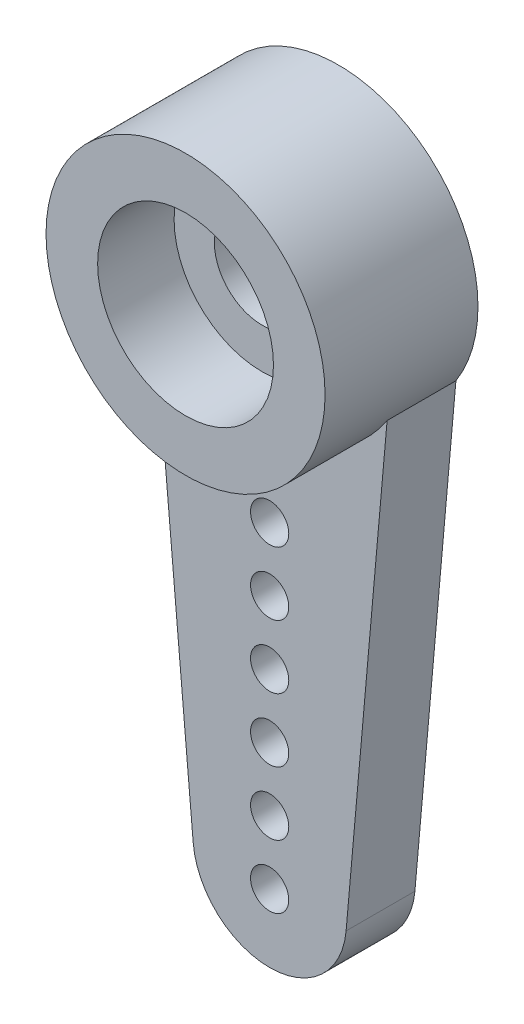
ISO-10303-21;
HEADER;
FILE_DESCRIPTION(('STEP AP214'),'2;1');
FILE_NAME('part.step','',(''),(''),'','','');
FILE_SCHEMA(('AUTOMOTIVE_DESIGN { 1 0 10303 214 1 1 1 1 }'));
ENDSEC;
DATA;
#1=APPLICATION_CONTEXT('core data for automotive mechanical design processes');
#2=APPLICATION_PROTOCOL_DEFINITION('international standard','automotive_design',2000,#1);
#3=PRODUCT_CONTEXT('',#1,'mechanical');
#4=PRODUCT('Part','Part','',(#3));
#5=PRODUCT_RELATED_PRODUCT_CATEGORY('part','',(#4));
#6=PRODUCT_DEFINITION_FORMATION('','',#4);
#7=PRODUCT_DEFINITION_CONTEXT('part definition',#1,'design');
#8=PRODUCT_DEFINITION('design','',#6,#7);
#9=PRODUCT_DEFINITION_SHAPE('','',#8);
#10=(LENGTH_UNIT() NAMED_UNIT(*) SI_UNIT(.MILLI.,.METRE.));
#11=(NAMED_UNIT(*) PLANE_ANGLE_UNIT() SI_UNIT($,.RADIAN.));
#12=(NAMED_UNIT(*) SI_UNIT($,.STERADIAN.) SOLID_ANGLE_UNIT());
#13=UNCERTAINTY_MEASURE_WITH_UNIT(LENGTH_MEASURE(1.E-05),#10,'distance_accuracy_value','');
#14=(GEOMETRIC_REPRESENTATION_CONTEXT(3) GLOBAL_UNCERTAINTY_ASSIGNED_CONTEXT((#13)) GLOBAL_UNIT_ASSIGNED_CONTEXT((#10,
#11,#12)) REPRESENTATION_CONTEXT('',''));
#15=CARTESIAN_POINT('',(0.,0.,0.));
#16=DIRECTION('',(0.,0.,1.));
#17=DIRECTION('',(1.,0.,0.));
#18=AXIS2_PLACEMENT_3D('',#15,#16,#17);
#19=CARTESIAN_POINT('',(0.,22.2676086956522,4.));
#20=DIRECTION('',(0.,0.,-1.));
#21=DIRECTION('',(-1.,0.,0.));
#22=AXIS2_PLACEMENT_3D('',#19,#20,#21);
#23=CYLINDRICAL_SURFACE('',#22,1.245);
#24=CARTESIAN_POINT('',(0.,22.2676086956522,0.));
#25=DIRECTION('',(0.,0.,-1.));
#26=DIRECTION('',(-1.,0.,0.));
#27=AXIS2_PLACEMENT_3D('',#24,#25,#26);
#28=CIRCLE('',#27,1.245);
#29=CARTESIAN_POINT('',(-1.245,22.2676086956522,0.));
#30=VERTEX_POINT('',#29);
#31=EDGE_CURVE('E85',#30,#30,#28,.T.);
#32=ORIENTED_EDGE('',*,*,#31,.T.);
#33=EDGE_LOOP('',(#32));
#34=FACE_BOUND('',#33,.T.);
#35=CARTESIAN_POINT('',(0.,22.2676086956522,2.));
#36=DIRECTION('',(0.,0.,1.));
#37=DIRECTION('',(1.,0.,0.));
#38=AXIS2_PLACEMENT_3D('',#35,#36,#37);
#39=CIRCLE('',#38,1.245);
#40=CARTESIAN_POINT('',(1.245,22.2676086956522,2.));
#41=VERTEX_POINT('',#40);
#42=EDGE_CURVE('E121',#41,#41,#39,.T.);
#43=ORIENTED_EDGE('',*,*,#42,.T.);
#44=EDGE_LOOP('',(#43));
#45=FACE_BOUND('',#44,.T.);
#46=ADVANCED_FACE('F37',(#34,#45),#23,.F.);
#47=CARTESIAN_POINT('',(-1.26331645783322,-0.111998607049884,1.8));
#48=DIRECTION('',(0.996093209916575,0.0883080809331399,0.));
#49=DIRECTION('',(-0.0883080809331399,0.996093209916575,0.));
#50=AXIS2_PLACEMENT_3D('',#47,#48,#49);
#51=PLANE('',#50);
#52=DIRECTION('',(0.0883080809331399,-0.996093209916575,0.));
#53=VECTOR('',#52,1.);
#54=CARTESIAN_POINT('',(-1.26331645783322,-0.111998607049884,0.));
#55=LINE('',#54,#53);
#56=CARTESIAN_POINT('',(-3.07271866593739,20.2976086956522,0.));
#57=VERTEX_POINT('',#56);
#58=CARTESIAN_POINT('',(-2.,8.19760869565218,0.));
#59=VERTEX_POINT('',#58);
#60=EDGE_CURVE('E80',#57,#59,#55,.T.);
#61=ORIENTED_EDGE('',*,*,#60,.T.);
#62=DIRECTION('',(0.,0.,-1.));
#63=VECTOR('',#62,1.);
#64=CARTESIAN_POINT('',(-2.,8.19760869565218,1.8));
#65=LINE('',#64,#63);
#66=CARTESIAN_POINT('',(-2.,8.19760869565218,1.8));
#67=VERTEX_POINT('',#66);
#68=EDGE_CURVE('E11',#67,#59,#65,.T.);
#69=ORIENTED_EDGE('',*,*,#68,.F.);
#70=DIRECTION('',(0.0883080809331399,-0.996093209916575,0.));
#71=VECTOR('',#70,1.);
#72=CARTESIAN_POINT('',(-1.26331645783322,-0.111998607049884,1.8));
#73=LINE('',#72,#71);
#74=CARTESIAN_POINT('',(-3.07271866593738,20.2976086956522,1.8));
#75=VERTEX_POINT('',#74);
#76=EDGE_CURVE('E96',#75,#67,#73,.T.);
#77=ORIENTED_EDGE('',*,*,#76,.F.);
#78=DIRECTION('',(0.,0.,-1.));
#79=VECTOR('',#78,1.);
#80=CARTESIAN_POINT('',(-3.07271866593739,20.2976086956522,1.8));
#81=LINE('',#80,#79);
#82=EDGE_CURVE('E93',#75,#57,#81,.T.);
#83=ORIENTED_EDGE('',*,*,#82,.T.);
#84=EDGE_LOOP('',(#61,#69,#77,#83));
#85=FACE_BOUND('',#84,.T.);
#86=ADVANCED_FACE('F39',(#85),#51,.F.);
#87=CARTESIAN_POINT('',(0.,8.37491756605505,1.8));
#88=DIRECTION('',(0.,0.,-1.));
#89=DIRECTION('',(-1.,0.,0.));
#90=AXIS2_PLACEMENT_3D('',#87,#88,#89);
#91=CYLINDRICAL_SURFACE('',#90,2.00784422591085);
#92=CARTESIAN_POINT('',(0.,8.37491756605505,0.));
#93=DIRECTION('',(0.,0.,1.));
#94=DIRECTION('',(1.,0.,0.));
#95=AXIS2_PLACEMENT_3D('',#92,#93,#94);
#96=CIRCLE('',#95,2.00784422591085);
#97=CARTESIAN_POINT('',(2.,8.19760869565218,0.));
#98=VERTEX_POINT('',#97);
#99=EDGE_CURVE('E97',#59,#98,#96,.T.);
#100=ORIENTED_EDGE('',*,*,#99,.T.);
#101=DIRECTION('',(0.,0.,-1.));
#102=VECTOR('',#101,1.);
#103=CARTESIAN_POINT('',(2.,8.19760869565218,1.8));
#104=LINE('',#103,#102);
#105=CARTESIAN_POINT('',(2.,8.19760869565218,1.8));
#106=VERTEX_POINT('',#105);
#107=EDGE_CURVE('E46',#106,#98,#104,.T.);
#108=ORIENTED_EDGE('',*,*,#107,.F.);
#109=CARTESIAN_POINT('',(0.,8.37491756605505,1.8));
#110=DIRECTION('',(0.,0.,1.));
#111=DIRECTION('',(1.,0.,0.));
#112=AXIS2_PLACEMENT_3D('',#109,#110,#111);
#113=CIRCLE('',#112,2.00784422591085);
#114=EDGE_CURVE('E54',#67,#106,#113,.T.);
#115=ORIENTED_EDGE('',*,*,#114,.F.);
#116=ORIENTED_EDGE('',*,*,#68,.T.);
#117=EDGE_LOOP('',(#100,#108,#115,#116));
#118=FACE_BOUND('',#117,.T.);
#119=ADVANCED_FACE('F180',(#118),#91,.T.);
#120=CARTESIAN_POINT('',(1.26331645783321,-0.111998607049883,1.8));
#121=DIRECTION('',(0.996093209916575,-0.0883080809331397,0.));
#122=DIRECTION('',(0.0883080809331397,0.996093209916575,0.));
#123=AXIS2_PLACEMENT_3D('',#120,#121,#122);
#124=PLANE('',#123);
#125=DIRECTION('',(-0.0883080809331397,-0.996093209916575,0.));
#126=VECTOR('',#125,1.);
#127=CARTESIAN_POINT('',(1.26331645783321,-0.111998607049883,0.));
#128=LINE('',#127,#126);
#129=CARTESIAN_POINT('',(3.07271866593738,20.2976086956522,0.));
#130=VERTEX_POINT('',#129);
#131=EDGE_CURVE('E77',#130,#98,#128,.T.);
#132=ORIENTED_EDGE('',*,*,#131,.F.);
#133=DIRECTION('',(0.,0.,-1.));
#134=VECTOR('',#133,1.);
#135=CARTESIAN_POINT('',(3.07271866593738,20.2976086956522,1.8));
#136=LINE('',#135,#134);
#137=CARTESIAN_POINT('',(3.07271866593737,20.2976086956522,1.8));
#138=VERTEX_POINT('',#137);
#139=EDGE_CURVE('E89',#138,#130,#136,.T.);
#140=ORIENTED_EDGE('',*,*,#139,.F.);
#141=DIRECTION('',(-0.0883080809331397,-0.996093209916575,0.));
#142=VECTOR('',#141,1.);
#143=CARTESIAN_POINT('',(1.26331645783321,-0.111998607049883,1.8));
#144=LINE('',#143,#142);
#145=EDGE_CURVE('E105',#138,#106,#144,.T.);
#146=ORIENTED_EDGE('',*,*,#145,.T.);
#147=ORIENTED_EDGE('',*,*,#107,.T.);
#148=EDGE_LOOP('',(#132,#140,#146,#147));
#149=FACE_BOUND('',#148,.T.);
#150=ADVANCED_FACE('F95',(#149),#124,.T.);
#151=CARTESIAN_POINT('',(0.,0.,1.8));
#152=DIRECTION('',(0.,0.,1.));
#153=DIRECTION('',(1.,0.,0.));
#154=AXIS2_PLACEMENT_3D('',#151,#152,#153);
#155=PLANE('',#154);
#156=CARTESIAN_POINT('',(0.,8.1470733401442,1.8));
#157=DIRECTION('',(0.,0.,1.));
#158=DIRECTION('',(1.,0.,0.));
#159=AXIS2_PLACEMENT_3D('',#156,#157,#158);
#160=CIRCLE('',#159,0.500000015999988);
#161=CARTESIAN_POINT('',(0.500000015999988,8.1470733401442,1.8));
#162=VERTEX_POINT('',#161);
#163=EDGE_CURVE('E159',#162,#162,#160,.T.);
#164=ORIENTED_EDGE('',*,*,#163,.F.);
#165=EDGE_LOOP('',(#164));
#166=FACE_BOUND('',#165,.T.);
#167=CARTESIAN_POINT('',(0.,9.80734101789819,1.8));
#168=DIRECTION('',(0.,0.,1.));
#169=DIRECTION('',(1.,0.,0.));
#170=AXIS2_PLACEMENT_3D('',#167,#168,#169);
#171=CIRCLE('',#170,0.500000015999988);
#172=CARTESIAN_POINT('',(0.500000015999982,9.80734101789819,1.8));
#173=VERTEX_POINT('',#172);
#174=EDGE_CURVE('E153',#173,#173,#171,.T.);
#175=ORIENTED_EDGE('',*,*,#174,.F.);
#176=EDGE_LOOP('',(#175));
#177=FACE_BOUND('',#176,.T.);
#178=CARTESIAN_POINT('',(0.,11.4676086956522,1.8));
#179=DIRECTION('',(0.,0.,1.));
#180=DIRECTION('',(1.,0.,0.));
#181=AXIS2_PLACEMENT_3D('',#178,#179,#180);
#182=CIRCLE('',#181,0.500000015999988);
#183=CARTESIAN_POINT('',(0.500000015999977,11.4676086956522,1.8));
#184=VERTEX_POINT('',#183);
#185=EDGE_CURVE('E147',#184,#184,#182,.T.);
#186=ORIENTED_EDGE('',*,*,#185,.F.);
#187=EDGE_LOOP('',(#186));
#188=FACE_BOUND('',#187,.T.);
#189=CARTESIAN_POINT('',(0.,13.1278763734062,1.8));
#190=DIRECTION('',(0.,0.,1.));
#191=DIRECTION('',(1.,0.,0.));
#192=AXIS2_PLACEMENT_3D('',#189,#190,#191);
#193=CIRCLE('',#192,0.500000015999988);
#194=CARTESIAN_POINT('',(0.500000015999971,13.1278763734062,1.8));
#195=VERTEX_POINT('',#194);
#196=EDGE_CURVE('E141',#195,#195,#193,.T.);
#197=ORIENTED_EDGE('',*,*,#196,.F.);
#198=EDGE_LOOP('',(#197));
#199=FACE_BOUND('',#198,.T.);
#200=CARTESIAN_POINT('',(0.,14.7881440511602,1.8));
#201=DIRECTION('',(0.,0.,1.));
#202=DIRECTION('',(1.,0.,0.));
#203=AXIS2_PLACEMENT_3D('',#200,#201,#202);
#204=CIRCLE('',#203,0.500000015999988);
#205=CARTESIAN_POINT('',(0.500000015999965,14.7881440511602,1.8));
#206=VERTEX_POINT('',#205);
#207=EDGE_CURVE('E135',#206,#206,#204,.T.);
#208=ORIENTED_EDGE('',*,*,#207,.F.);
#209=EDGE_LOOP('',(#208));
#210=FACE_BOUND('',#209,.T.);
#211=CARTESIAN_POINT('',(0.,16.4484117289141,1.8));
#212=DIRECTION('',(0.,0.,1.));
#213=DIRECTION('',(1.,0.,0.));
#214=AXIS2_PLACEMENT_3D('',#211,#212,#213);
#215=CIRCLE('',#214,0.500000015999988);
#216=CARTESIAN_POINT('',(0.500000015999959,16.4484117289141,1.8));
#217=VERTEX_POINT('',#216);
#218=EDGE_CURVE('E129',#217,#217,#215,.T.);
#219=ORIENTED_EDGE('',*,*,#218,.F.);
#220=EDGE_LOOP('',(#219));
#221=FACE_BOUND('',#220,.T.);
#222=ORIENTED_EDGE('',*,*,#76,.T.);
#223=ORIENTED_EDGE('',*,*,#114,.T.);
#224=ORIENTED_EDGE('',*,*,#145,.F.);
#225=CARTESIAN_POINT('',(0.,22.2676086956522,1.8));
#226=DIRECTION('',(0.,0.,1.));
#227=DIRECTION('',(1.,0.,0.));
#228=AXIS2_PLACEMENT_3D('',#225,#226,#227);
#229=CIRCLE('',#228,3.65);
#230=EDGE_CURVE('E92',#75,#138,#229,.T.);
#231=ORIENTED_EDGE('',*,*,#230,.F.);
#232=EDGE_LOOP('',(#222,#223,#224,#231));
#233=FACE_BOUND('',#232,.T.);
#234=ADVANCED_FACE('F165',(#166,#177,#188,#199,#210,#221,#233),#155,.T.);
#235=CARTESIAN_POINT('',(0.,0.,0.));
#236=DIRECTION('',(0.,0.,1.));
#237=DIRECTION('',(1.,0.,0.));
#238=AXIS2_PLACEMENT_3D('',#235,#236,#237);
#239=PLANE('',#238);
#240=CARTESIAN_POINT('',(0.,8.1470733401442,0.));
#241=DIRECTION('',(0.,0.,1.));
#242=DIRECTION('',(1.,0.,0.));
#243=AXIS2_PLACEMENT_3D('',#240,#241,#242);
#244=CIRCLE('',#243,0.500000015999988);
#245=CARTESIAN_POINT('',(0.500000015999988,8.1470733401442,0.));
#246=VERTEX_POINT('',#245);
#247=EDGE_CURVE('E156',#246,#246,#244,.T.);
#248=ORIENTED_EDGE('',*,*,#247,.T.);
#249=EDGE_LOOP('',(#248));
#250=FACE_BOUND('',#249,.T.);
#251=CARTESIAN_POINT('',(0.,9.80734101789819,0.));
#252=DIRECTION('',(0.,0.,1.));
#253=DIRECTION('',(1.,0.,0.));
#254=AXIS2_PLACEMENT_3D('',#251,#252,#253);
#255=CIRCLE('',#254,0.500000015999988);
#256=CARTESIAN_POINT('',(0.500000015999982,9.80734101789819,0.));
#257=VERTEX_POINT('',#256);
#258=EDGE_CURVE('E150',#257,#257,#255,.T.);
#259=ORIENTED_EDGE('',*,*,#258,.T.);
#260=EDGE_LOOP('',(#259));
#261=FACE_BOUND('',#260,.T.);
#262=CARTESIAN_POINT('',(0.,11.4676086956522,0.));
#263=DIRECTION('',(0.,0.,1.));
#264=DIRECTION('',(1.,0.,0.));
#265=AXIS2_PLACEMENT_3D('',#262,#263,#264);
#266=CIRCLE('',#265,0.500000015999988);
#267=CARTESIAN_POINT('',(0.500000015999977,11.4676086956522,0.));
#268=VERTEX_POINT('',#267);
#269=EDGE_CURVE('E144',#268,#268,#266,.T.);
#270=ORIENTED_EDGE('',*,*,#269,.T.);
#271=EDGE_LOOP('',(#270));
#272=FACE_BOUND('',#271,.T.);
#273=CARTESIAN_POINT('',(0.,13.1278763734062,0.));
#274=DIRECTION('',(0.,0.,1.));
#275=DIRECTION('',(1.,0.,0.));
#276=AXIS2_PLACEMENT_3D('',#273,#274,#275);
#277=CIRCLE('',#276,0.500000015999988);
#278=CARTESIAN_POINT('',(0.500000015999971,13.1278763734062,0.));
#279=VERTEX_POINT('',#278);
#280=EDGE_CURVE('E138',#279,#279,#277,.T.);
#281=ORIENTED_EDGE('',*,*,#280,.T.);
#282=EDGE_LOOP('',(#281));
#283=FACE_BOUND('',#282,.T.);
#284=CARTESIAN_POINT('',(0.,14.7881440511602,0.));
#285=DIRECTION('',(0.,0.,1.));
#286=DIRECTION('',(1.,0.,0.));
#287=AXIS2_PLACEMENT_3D('',#284,#285,#286);
#288=CIRCLE('',#287,0.500000015999988);
#289=CARTESIAN_POINT('',(0.500000015999965,14.7881440511602,0.));
#290=VERTEX_POINT('',#289);
#291=EDGE_CURVE('E132',#290,#290,#288,.T.);
#292=ORIENTED_EDGE('',*,*,#291,.T.);
#293=EDGE_LOOP('',(#292));
#294=FACE_BOUND('',#293,.T.);
#295=CARTESIAN_POINT('',(0.,16.4484117289141,0.));
#296=DIRECTION('',(0.,0.,1.));
#297=DIRECTION('',(1.,0.,0.));
#298=AXIS2_PLACEMENT_3D('',#295,#296,#297);
#299=CIRCLE('',#298,0.500000015999988);
#300=CARTESIAN_POINT('',(0.500000015999959,16.4484117289141,0.));
#301=VERTEX_POINT('',#300);
#302=EDGE_CURVE('E126',#301,#301,#299,.T.);
#303=ORIENTED_EDGE('',*,*,#302,.T.);
#304=EDGE_LOOP('',(#303));
#305=FACE_BOUND('',#304,.T.);
#306=ORIENTED_EDGE('',*,*,#60,.F.);
#307=CARTESIAN_POINT('',(0.,22.2676086956522,0.));
#308=DIRECTION('',(0.,0.,-1.));
#309=DIRECTION('',(-1.,0.,0.));
#310=AXIS2_PLACEMENT_3D('',#307,#308,#309);
#311=CIRCLE('',#310,3.65);
#312=EDGE_CURVE('E73',#57,#130,#311,.T.);
#313=ORIENTED_EDGE('',*,*,#312,.T.);
#314=ORIENTED_EDGE('',*,*,#131,.T.);
#315=ORIENTED_EDGE('',*,*,#99,.F.);
#316=EDGE_LOOP('',(#306,#313,#314,#315));
#317=FACE_BOUND('',#316,.T.);
#318=ORIENTED_EDGE('',*,*,#31,.F.);
#319=EDGE_LOOP('',(#318));
#320=FACE_BOUND('',#319,.T.);
#321=ADVANCED_FACE('F75',(#250,#261,#272,#283,#294,#305,#317,#320),#239,.F.);
#322=CARTESIAN_POINT('',(0.,22.2676086956522,4.));
#323=DIRECTION('',(0.,0.,-1.));
#324=DIRECTION('',(-1.,0.,0.));
#325=AXIS2_PLACEMENT_3D('',#322,#323,#324);
#326=CYLINDRICAL_SURFACE('',#325,3.65);
#327=CARTESIAN_POINT('',(0.,22.2676086956522,4.));
#328=DIRECTION('',(0.,0.,-1.));
#329=DIRECTION('',(-1.,0.,0.));
#330=AXIS2_PLACEMENT_3D('',#327,#328,#329);
#331=CIRCLE('',#330,3.65);
#332=CARTESIAN_POINT('',(-3.65,22.2676086956522,4.));
#333=VERTEX_POINT('',#332);
#334=EDGE_CURVE('E84',#333,#333,#331,.T.);
#335=ORIENTED_EDGE('',*,*,#334,.T.);
#336=EDGE_LOOP('',(#335));
#337=FACE_BOUND('',#336,.T.);
#338=ORIENTED_EDGE('',*,*,#82,.F.);
#339=ORIENTED_EDGE('',*,*,#230,.T.);
#340=ORIENTED_EDGE('',*,*,#139,.T.);
#341=ORIENTED_EDGE('',*,*,#312,.F.);
#342=EDGE_LOOP('',(#338,#339,#340,#341));
#343=FACE_BOUND('',#342,.T.);
#344=ADVANCED_FACE('F90',(#337,#343),#326,.T.);
#345=CARTESIAN_POINT('',(0.,22.2676086956522,4.));
#346=DIRECTION('',(0.,0.,-1.));
#347=DIRECTION('',(-1.,0.,0.));
#348=AXIS2_PLACEMENT_3D('',#345,#346,#347);
#349=PLANE('',#348);
#350=CARTESIAN_POINT('',(0.,22.2676086956522,4.));
#351=DIRECTION('',(0.,0.,1.));
#352=DIRECTION('',(1.,0.,0.));
#353=AXIS2_PLACEMENT_3D('',#350,#351,#352);
#354=CIRCLE('',#353,2.3);
#355=CARTESIAN_POINT('',(2.3,22.2676086956522,4.));
#356=VERTEX_POINT('',#355);
#357=EDGE_CURVE('E118',#356,#356,#354,.T.);
#358=ORIENTED_EDGE('',*,*,#357,.F.);
#359=EDGE_LOOP('',(#358));
#360=FACE_BOUND('',#359,.T.);
#361=ORIENTED_EDGE('',*,*,#334,.F.);
#362=EDGE_LOOP('',(#361));
#363=FACE_BOUND('',#362,.T.);
#364=ADVANCED_FACE('F199',(#360,#363),#349,.F.);
#365=CARTESIAN_POINT('',(0.,22.2676086956522,2.));
#366=DIRECTION('',(0.,0.,1.));
#367=DIRECTION('',(1.,0.,0.));
#368=AXIS2_PLACEMENT_3D('',#365,#366,#367);
#369=CYLINDRICAL_SURFACE('',#368,2.3);
#370=CARTESIAN_POINT('',(0.,22.2676086956522,2.));
#371=DIRECTION('',(0.,0.,1.));
#372=DIRECTION('',(1.,0.,0.));
#373=AXIS2_PLACEMENT_3D('',#370,#371,#372);
#374=CIRCLE('',#373,2.3);
#375=CARTESIAN_POINT('',(2.3,22.2676086956522,2.));
#376=VERTEX_POINT('',#375);
#377=EDGE_CURVE('E117',#376,#376,#374,.T.);
#378=ORIENTED_EDGE('',*,*,#377,.F.);
#379=EDGE_LOOP('',(#378));
#380=FACE_BOUND('',#379,.T.);
#381=ORIENTED_EDGE('',*,*,#357,.T.);
#382=EDGE_LOOP('',(#381));
#383=FACE_BOUND('',#382,.T.);
#384=ADVANCED_FACE('F197',(#380,#383),#369,.F.);
#385=CARTESIAN_POINT('',(0.,22.2676086956522,2.));
#386=DIRECTION('',(0.,0.,1.));
#387=DIRECTION('',(1.,0.,0.));
#388=AXIS2_PLACEMENT_3D('',#385,#386,#387);
#389=PLANE('',#388);
#390=ORIENTED_EDGE('',*,*,#42,.F.);
#391=EDGE_LOOP('',(#390));
#392=FACE_BOUND('',#391,.T.);
#393=ORIENTED_EDGE('',*,*,#377,.T.);
#394=EDGE_LOOP('',(#393));
#395=FACE_BOUND('',#394,.T.);
#396=ADVANCED_FACE('F225',(#392,#395),#389,.T.);
#397=CARTESIAN_POINT('',(0.,16.4484117289141,1.8));
#398=DIRECTION('',(0.,0.,1.));
#399=DIRECTION('',(1.,0.,0.));
#400=AXIS2_PLACEMENT_3D('',#397,#398,#399);
#401=CYLINDRICAL_SURFACE('',#400,0.500000015999988);
#402=ORIENTED_EDGE('',*,*,#302,.F.);
#403=EDGE_LOOP('',(#402));
#404=FACE_BOUND('',#403,.T.);
#405=ORIENTED_EDGE('',*,*,#218,.T.);
#406=EDGE_LOOP('',(#405));
#407=FACE_BOUND('',#406,.T.);
#408=ADVANCED_FACE('F221',(#404,#407),#401,.F.);
#409=CARTESIAN_POINT('',(0.,14.7881440511602,1.8));
#410=DIRECTION('',(0.,0.,1.));
#411=DIRECTION('',(1.,0.,0.));
#412=AXIS2_PLACEMENT_3D('',#409,#410,#411);
#413=CYLINDRICAL_SURFACE('',#412,0.500000015999988);
#414=ORIENTED_EDGE('',*,*,#291,.F.);
#415=EDGE_LOOP('',(#414));
#416=FACE_BOUND('',#415,.T.);
#417=ORIENTED_EDGE('',*,*,#207,.T.);
#418=EDGE_LOOP('',(#417));
#419=FACE_BOUND('',#418,.T.);
#420=ADVANCED_FACE('F224',(#416,#419),#413,.F.);
#421=CARTESIAN_POINT('',(0.,13.1278763734062,1.8));
#422=DIRECTION('',(0.,0.,1.));
#423=DIRECTION('',(1.,0.,0.));
#424=AXIS2_PLACEMENT_3D('',#421,#422,#423);
#425=CYLINDRICAL_SURFACE('',#424,0.500000015999988);
#426=ORIENTED_EDGE('',*,*,#280,.F.);
#427=EDGE_LOOP('',(#426));
#428=FACE_BOUND('',#427,.T.);
#429=ORIENTED_EDGE('',*,*,#196,.T.);
#430=EDGE_LOOP('',(#429));
#431=FACE_BOUND('',#430,.T.);
#432=ADVANCED_FACE('F231',(#428,#431),#425,.F.);
#433=CARTESIAN_POINT('',(0.,11.4676086956522,1.8));
#434=DIRECTION('',(0.,0.,1.));
#435=DIRECTION('',(1.,0.,0.));
#436=AXIS2_PLACEMENT_3D('',#433,#434,#435);
#437=CYLINDRICAL_SURFACE('',#436,0.500000015999988);
#438=ORIENTED_EDGE('',*,*,#269,.F.);
#439=EDGE_LOOP('',(#438));
#440=FACE_BOUND('',#439,.T.);
#441=ORIENTED_EDGE('',*,*,#185,.T.);
#442=EDGE_LOOP('',(#441));
#443=FACE_BOUND('',#442,.T.);
#444=ADVANCED_FACE('F238',(#440,#443),#437,.F.);
#445=CARTESIAN_POINT('',(0.,9.80734101789819,1.8));
#446=DIRECTION('',(0.,0.,1.));
#447=DIRECTION('',(1.,0.,0.));
#448=AXIS2_PLACEMENT_3D('',#445,#446,#447);
#449=CYLINDRICAL_SURFACE('',#448,0.500000015999988);
#450=ORIENTED_EDGE('',*,*,#258,.F.);
#451=EDGE_LOOP('',(#450));
#452=FACE_BOUND('',#451,.T.);
#453=ORIENTED_EDGE('',*,*,#174,.T.);
#454=EDGE_LOOP('',(#453));
#455=FACE_BOUND('',#454,.T.);
#456=ADVANCED_FACE('F242',(#452,#455),#449,.F.);
#457=CARTESIAN_POINT('',(0.,8.1470733401442,1.8));
#458=DIRECTION('',(0.,0.,1.));
#459=DIRECTION('',(1.,0.,0.));
#460=AXIS2_PLACEMENT_3D('',#457,#458,#459);
#461=CYLINDRICAL_SURFACE('',#460,0.500000015999988);
#462=ORIENTED_EDGE('',*,*,#247,.F.);
#463=EDGE_LOOP('',(#462));
#464=FACE_BOUND('',#463,.T.);
#465=ORIENTED_EDGE('',*,*,#163,.T.);
#466=EDGE_LOOP('',(#465));
#467=FACE_BOUND('',#466,.T.);
#468=ADVANCED_FACE('F163',(#464,#467),#461,.F.);
#469=CLOSED_SHELL('',(#46,#86,#119,#150,#234,#321,#344,#364,#384,#396,#408,#420,#432,#444,#456,#468));
#470=MANIFOLD_SOLID_BREP('B2',#469);
#471=ADVANCED_BREP_SHAPE_REPRESENTATION('',(#18,#470),#14);
#472=SHAPE_DEFINITION_REPRESENTATION(#9,#471);
ENDSEC;
END-ISO-10303-21;
